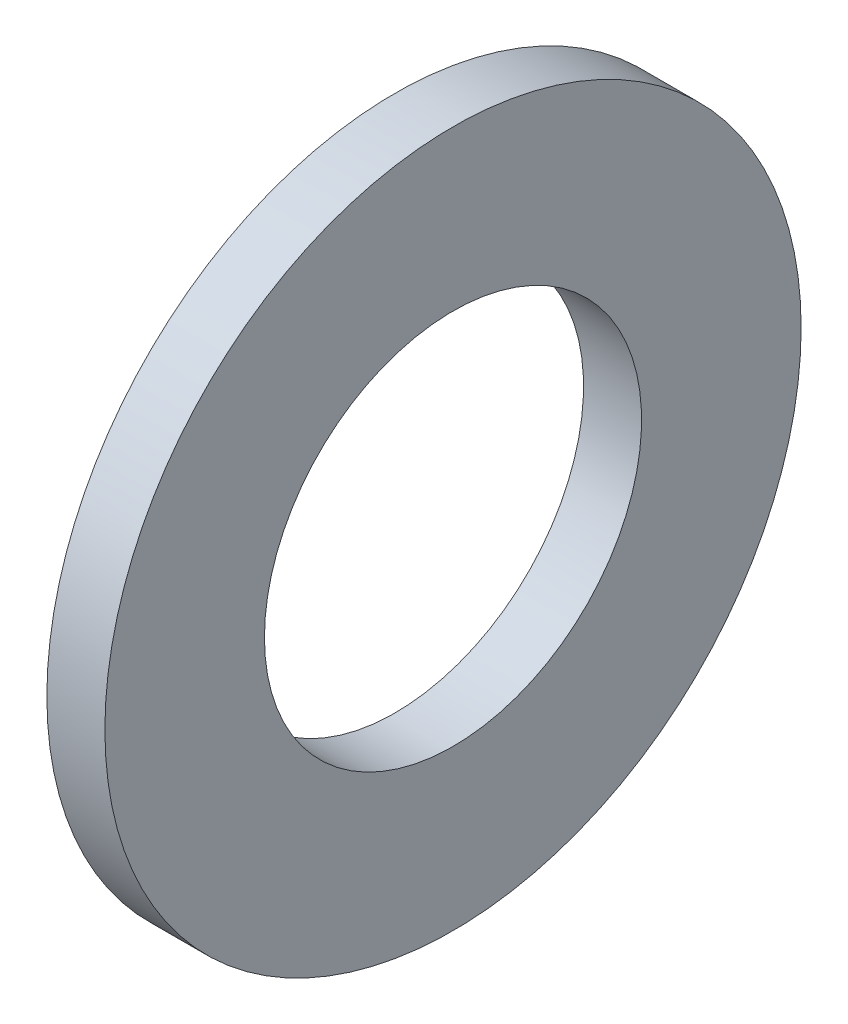
ISO-10303-21;
HEADER;
FILE_DESCRIPTION(('STEP AP214'),'2;1');
FILE_NAME('part.step','',(''),(''),'','','');
FILE_SCHEMA(('AUTOMOTIVE_DESIGN { 1 0 10303 214 1 1 1 1 }'));
ENDSEC;
DATA;
#1=APPLICATION_CONTEXT('core data for automotive mechanical design processes');
#2=APPLICATION_PROTOCOL_DEFINITION('international standard','automotive_design',2000,#1);
#3=PRODUCT_CONTEXT('',#1,'mechanical');
#4=PRODUCT('Part','Part','',(#3));
#5=PRODUCT_RELATED_PRODUCT_CATEGORY('part','',(#4));
#6=PRODUCT_DEFINITION_FORMATION('','',#4);
#7=PRODUCT_DEFINITION_CONTEXT('part definition',#1,'design');
#8=PRODUCT_DEFINITION('design','',#6,#7);
#9=PRODUCT_DEFINITION_SHAPE('','',#8);
#10=(LENGTH_UNIT() NAMED_UNIT(*) SI_UNIT(.MILLI.,.METRE.));
#11=(NAMED_UNIT(*) PLANE_ANGLE_UNIT() SI_UNIT($,.RADIAN.));
#12=(NAMED_UNIT(*) SI_UNIT($,.STERADIAN.) SOLID_ANGLE_UNIT());
#13=UNCERTAINTY_MEASURE_WITH_UNIT(LENGTH_MEASURE(1.E-05),#10,'distance_accuracy_value','');
#14=(GEOMETRIC_REPRESENTATION_CONTEXT(3) GLOBAL_UNCERTAINTY_ASSIGNED_CONTEXT((#13)) GLOBAL_UNIT_ASSIGNED_CONTEXT((#10,
#11,#12)) REPRESENTATION_CONTEXT('',''));
#15=CARTESIAN_POINT('',(0.,0.,0.));
#16=DIRECTION('',(0.,0.,1.));
#17=DIRECTION('',(1.,0.,0.));
#18=AXIS2_PLACEMENT_3D('',#15,#16,#17);
#19=CARTESIAN_POINT('',(-34.9249999999999,0.,0.));
#20=DIRECTION('',(-1.,0.,0.));
#21=DIRECTION('',(0.,0.,1.));
#22=AXIS2_PLACEMENT_3D('',#19,#20,#21);
#23=CYLINDRICAL_SURFACE('',#22,6.5);
#24=CARTESIAN_POINT('',(0.,0.,0.));
#25=DIRECTION('',(-1.,0.,0.));
#26=DIRECTION('',(0.,0.,1.));
#27=AXIS2_PLACEMENT_3D('',#24,#25,#26);
#28=CIRCLE('',#27,6.5);
#29=CARTESIAN_POINT('',(0.,0.,6.5));
#30=VERTEX_POINT('',#29);
#31=EDGE_CURVE('E10',#30,#30,#28,.T.);
#32=ORIENTED_EDGE('',*,*,#31,.F.);
#33=EDGE_LOOP('',(#32));
#34=FACE_BOUND('',#33,.T.);
#35=CARTESIAN_POINT('',(-2.,0.,0.));
#36=DIRECTION('',(-1.,0.,0.));
#37=DIRECTION('',(0.,0.,1.));
#38=AXIS2_PLACEMENT_3D('',#35,#36,#37);
#39=CIRCLE('',#38,6.5);
#40=CARTESIAN_POINT('',(-2.,0.,6.5));
#41=VERTEX_POINT('',#40);
#42=EDGE_CURVE('E44',#41,#41,#39,.T.);
#43=ORIENTED_EDGE('',*,*,#42,.T.);
#44=EDGE_LOOP('',(#43));
#45=FACE_BOUND('',#44,.T.);
#46=ADVANCED_FACE('F30',(#34,#45),#23,.F.);
#47=CARTESIAN_POINT('',(0.,6.5,0.));
#48=DIRECTION('',(-1.,0.,0.));
#49=DIRECTION('',(0.,0.,1.));
#50=AXIS2_PLACEMENT_3D('',#47,#48,#49);
#51=PLANE('',#50);
#52=CARTESIAN_POINT('',(0.,0.,0.));
#53=DIRECTION('',(-1.,0.,0.));
#54=DIRECTION('',(0.,0.,1.));
#55=AXIS2_PLACEMENT_3D('',#52,#53,#54);
#56=CIRCLE('',#55,12.);
#57=CARTESIAN_POINT('',(0.,0.,12.));
#58=VERTEX_POINT('',#57);
#59=EDGE_CURVE('E36',#58,#58,#56,.T.);
#60=ORIENTED_EDGE('',*,*,#59,.F.);
#61=EDGE_LOOP('',(#60));
#62=FACE_BOUND('',#61,.T.);
#63=ORIENTED_EDGE('',*,*,#31,.T.);
#64=EDGE_LOOP('',(#63));
#65=FACE_BOUND('',#64,.T.);
#66=ADVANCED_FACE('F59',(#62,#65),#51,.F.);
#67=CARTESIAN_POINT('',(-34.9249999999999,0.,0.));
#68=DIRECTION('',(-1.,0.,0.));
#69=DIRECTION('',(0.,0.,1.));
#70=AXIS2_PLACEMENT_3D('',#67,#68,#69);
#71=CYLINDRICAL_SURFACE('',#70,12.);
#72=CARTESIAN_POINT('',(-2.,0.,0.));
#73=DIRECTION('',(-1.,0.,0.));
#74=DIRECTION('',(0.,0.,1.));
#75=AXIS2_PLACEMENT_3D('',#72,#73,#74);
#76=CIRCLE('',#75,12.);
#77=CARTESIAN_POINT('',(-2.,0.,12.));
#78=VERTEX_POINT('',#77);
#79=EDGE_CURVE('E40',#78,#78,#76,.T.);
#80=ORIENTED_EDGE('',*,*,#79,.F.);
#81=EDGE_LOOP('',(#80));
#82=FACE_BOUND('',#81,.T.);
#83=ORIENTED_EDGE('',*,*,#59,.T.);
#84=EDGE_LOOP('',(#83));
#85=FACE_BOUND('',#84,.T.);
#86=ADVANCED_FACE('F54',(#82,#85),#71,.T.);
#87=CARTESIAN_POINT('',(-2.,12.,0.));
#88=DIRECTION('',(1.,0.,0.));
#89=DIRECTION('',(0.,0.,-1.));
#90=AXIS2_PLACEMENT_3D('',#87,#88,#89);
#91=PLANE('',#90);
#92=ORIENTED_EDGE('',*,*,#42,.F.);
#93=EDGE_LOOP('',(#92));
#94=FACE_BOUND('',#93,.T.);
#95=ORIENTED_EDGE('',*,*,#79,.T.);
#96=EDGE_LOOP('',(#95));
#97=FACE_BOUND('',#96,.T.);
#98=ADVANCED_FACE('F51',(#94,#97),#91,.F.);
#99=CLOSED_SHELL('',(#46,#66,#86,#98));
#100=MANIFOLD_SOLID_BREP('B2',#99);
#101=ADVANCED_BREP_SHAPE_REPRESENTATION('',(#18,#100),#14);
#102=SHAPE_DEFINITION_REPRESENTATION(#9,#101);
ENDSEC;
END-ISO-10303-21;
